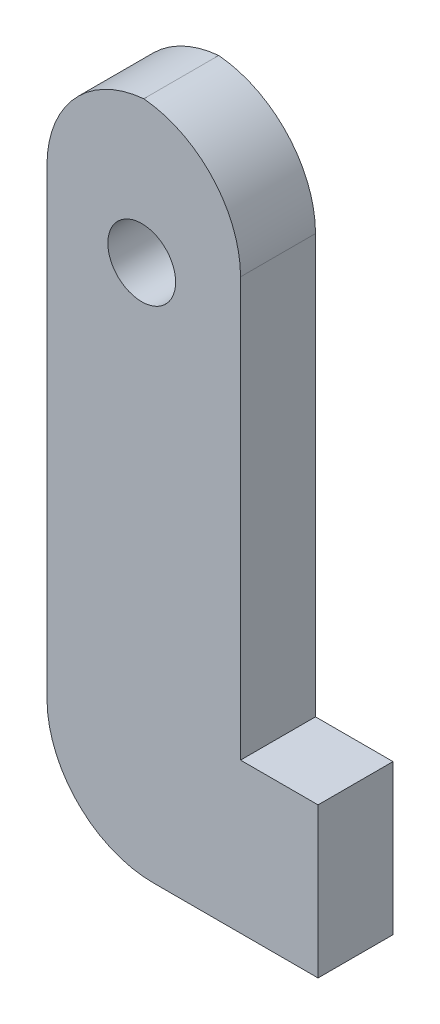
ISO-10303-21;
HEADER;
FILE_DESCRIPTION(('STEP AP214'),'2;1');
FILE_NAME('part.step','',(''),(''),'','','');
FILE_SCHEMA(('AUTOMOTIVE_DESIGN { 1 0 10303 214 1 1 1 1 }'));
ENDSEC;
DATA;
#1=APPLICATION_CONTEXT('core data for automotive mechanical design processes');
#2=APPLICATION_PROTOCOL_DEFINITION('international standard','automotive_design',2000,#1);
#3=PRODUCT_CONTEXT('',#1,'mechanical');
#4=PRODUCT('Part','Part','',(#3));
#5=PRODUCT_RELATED_PRODUCT_CATEGORY('part','',(#4));
#6=PRODUCT_DEFINITION_FORMATION('','',#4);
#7=PRODUCT_DEFINITION_CONTEXT('part definition',#1,'design');
#8=PRODUCT_DEFINITION('design','',#6,#7);
#9=PRODUCT_DEFINITION_SHAPE('','',#8);
#10=(LENGTH_UNIT() NAMED_UNIT(*) SI_UNIT(.MILLI.,.METRE.));
#11=(NAMED_UNIT(*) PLANE_ANGLE_UNIT() SI_UNIT($,.RADIAN.));
#12=(NAMED_UNIT(*) SI_UNIT($,.STERADIAN.) SOLID_ANGLE_UNIT());
#13=UNCERTAINTY_MEASURE_WITH_UNIT(LENGTH_MEASURE(1.E-05),#10,'distance_accuracy_value','');
#14=(GEOMETRIC_REPRESENTATION_CONTEXT(3) GLOBAL_UNCERTAINTY_ASSIGNED_CONTEXT((#13)) GLOBAL_UNIT_ASSIGNED_CONTEXT((#10,
#11,#12)) REPRESENTATION_CONTEXT('',''));
#15=CARTESIAN_POINT('',(0.,0.,0.));
#16=DIRECTION('',(0.,0.,1.));
#17=DIRECTION('',(1.,0.,0.));
#18=AXIS2_PLACEMENT_3D('',#15,#16,#17);
#19=CARTESIAN_POINT('',(0.,0.,6.35));
#20=DIRECTION('',(0.,0.,-1.));
#21=DIRECTION('',(-1.,0.,0.));
#22=AXIS2_PLACEMENT_3D('',#19,#20,#21);
#23=PLANE('',#22);
#24=DIRECTION('',(0.,-1.,0.));
#25=VECTOR('',#24,1.);
#26=CARTESIAN_POINT('',(-61.6,14.2826348225761,6.35));
#27=LINE('',#26,#25);
#28=CARTESIAN_POINT('',(-61.6,62.432634822576,6.35));
#29=VERTEX_POINT('',#28);
#30=CARTESIAN_POINT('',(-61.6,23.282634822576,6.35));
#31=VERTEX_POINT('',#30);
#32=EDGE_CURVE('E161',#29,#31,#27,.T.);
#33=ORIENTED_EDGE('',*,*,#32,.T.);
#34=CARTESIAN_POINT('',(-52.6,23.282634822576,6.35));
#35=DIRECTION('',(0.,0.,-1.));
#36=DIRECTION('',(-1.,0.,0.));
#37=AXIS2_PLACEMENT_3D('',#34,#35,#36);
#38=CIRCLE('',#37,9.);
#39=CARTESIAN_POINT('',(-52.6,14.2826348225761,6.35));
#40=VERTEX_POINT('',#39);
#41=EDGE_CURVE('E11',#31,#40,#38,.F.);
#42=ORIENTED_EDGE('',*,*,#41,.T.);
#43=DIRECTION('',(1.,0.,0.));
#44=VECTOR('',#43,1.);
#45=CARTESIAN_POINT('',(-45.2069500644702,14.2826348225761,6.35));
#46=LINE('',#45,#44);
#47=CARTESIAN_POINT('',(-38.6420901517407,14.2826348225761,6.35));
#48=VERTEX_POINT('',#47);
#49=EDGE_CURVE('E115',#40,#48,#46,.T.);
#50=ORIENTED_EDGE('',*,*,#49,.T.);
#51=DIRECTION('',(0.,1.,0.));
#52=VECTOR('',#51,1.);
#53=CARTESIAN_POINT('',(-38.6420901517407,26.9826348225761,6.35));
#54=LINE('',#53,#52);
#55=CARTESIAN_POINT('',(-38.6420901517407,26.9826348225761,6.35));
#56=VERTEX_POINT('',#55);
#57=EDGE_CURVE('E110',#48,#56,#54,.T.);
#58=ORIENTED_EDGE('',*,*,#57,.T.);
#59=DIRECTION('',(-1.,0.,0.));
#60=VECTOR('',#59,1.);
#61=CARTESIAN_POINT('',(-38.6420901517407,26.9826348225761,6.35));
#62=LINE('',#61,#60);
#63=CARTESIAN_POINT('',(-45.2069500644702,26.9826348225761,6.35));
#64=VERTEX_POINT('',#63);
#65=EDGE_CURVE('E98',#56,#64,#62,.T.);
#66=ORIENTED_EDGE('',*,*,#65,.T.);
#67=DIRECTION('',(0.,1.,0.));
#68=VECTOR('',#67,1.);
#69=CARTESIAN_POINT('',(-45.2069500644702,26.9826348225761,6.35));
#70=LINE('',#69,#68);
#71=CARTESIAN_POINT('',(-45.2069500644702,62.432634822576,6.35));
#72=VERTEX_POINT('',#71);
#73=EDGE_CURVE('E109',#64,#72,#70,.T.);
#74=ORIENTED_EDGE('',*,*,#73,.T.);
#75=CARTESIAN_POINT('',(-54.2069500644702,62.4326348225761,6.35));
#76=DIRECTION('',(0.,0.,-1.));
#77=DIRECTION('',(-1.,0.,0.));
#78=AXIS2_PLACEMENT_3D('',#75,#76,#77);
#79=CIRCLE('',#78,9.);
#80=CARTESIAN_POINT('',(-53.4034750322351,71.3966979567008,6.35));
#81=VERTEX_POINT('',#80);
#82=EDGE_CURVE('E138',#72,#81,#79,.F.);
#83=ORIENTED_EDGE('',*,*,#82,.T.);
#84=CARTESIAN_POINT('',(-52.6,62.4326348225761,6.35));
#85=DIRECTION('',(0.,0.,-1.));
#86=DIRECTION('',(-1.,0.,0.));
#87=AXIS2_PLACEMENT_3D('',#84,#85,#86);
#88=CIRCLE('',#87,9.);
#89=EDGE_CURVE('E136',#81,#29,#88,.F.);
#90=ORIENTED_EDGE('',*,*,#89,.T.);
#91=EDGE_LOOP('',(#33,#42,#50,#58,#66,#74,#83,#90));
#92=FACE_BOUND('',#91,.T.);
#93=CARTESIAN_POINT('',(-53.575,59.2899417882053,6.35));
#94=DIRECTION('',(0.,0.,1.));
#95=DIRECTION('',(1.,0.,0.));
#96=AXIS2_PLACEMENT_3D('',#93,#94,#95);
#97=CIRCLE('',#96,2.87019999999999);
#98=CARTESIAN_POINT('',(-50.7048,59.2899417882053,6.35));
#99=VERTEX_POINT('',#98);
#100=EDGE_CURVE('E168',#99,#99,#97,.T.);
#101=ORIENTED_EDGE('',*,*,#100,.F.);
#102=EDGE_LOOP('',(#101));
#103=FACE_BOUND('',#102,.T.);
#104=ADVANCED_FACE('F33',(#92,#103),#23,.F.);
#105=CARTESIAN_POINT('',(0.,0.,0.));
#106=DIRECTION('',(0.,0.,-1.));
#107=DIRECTION('',(-1.,0.,0.));
#108=AXIS2_PLACEMENT_3D('',#105,#106,#107);
#109=PLANE('',#108);
#110=DIRECTION('',(1.,0.,0.));
#111=VECTOR('',#110,1.);
#112=CARTESIAN_POINT('',(-38.6420901517407,14.2826348225761,0.));
#113=LINE('',#112,#111);
#114=CARTESIAN_POINT('',(-52.6,14.282634822576,0.));
#115=VERTEX_POINT('',#114);
#116=CARTESIAN_POINT('',(-38.6420901517407,14.2826348225761,0.));
#117=VERTEX_POINT('',#116);
#118=EDGE_CURVE('E119',#115,#117,#113,.T.);
#119=ORIENTED_EDGE('',*,*,#118,.F.);
#120=CARTESIAN_POINT('',(-52.6,23.282634822576,0.));
#121=DIRECTION('',(0.,0.,-1.));
#122=DIRECTION('',(-1.,0.,0.));
#123=AXIS2_PLACEMENT_3D('',#120,#121,#122);
#124=CIRCLE('',#123,9.);
#125=CARTESIAN_POINT('',(-61.6,23.282634822576,0.));
#126=VERTEX_POINT('',#125);
#127=EDGE_CURVE('E55',#115,#126,#124,.T.);
#128=ORIENTED_EDGE('',*,*,#127,.T.);
#129=DIRECTION('',(0.,-1.,0.));
#130=VECTOR('',#129,1.);
#131=CARTESIAN_POINT('',(-61.6,14.2826348225761,0.));
#132=LINE('',#131,#130);
#133=CARTESIAN_POINT('',(-61.6,62.432634822576,0.));
#134=VERTEX_POINT('',#133);
#135=EDGE_CURVE('E156',#134,#126,#132,.T.);
#136=ORIENTED_EDGE('',*,*,#135,.F.);
#137=CARTESIAN_POINT('',(-52.6,62.4326348225761,0.));
#138=DIRECTION('',(0.,0.,-1.));
#139=DIRECTION('',(-1.,0.,0.));
#140=AXIS2_PLACEMENT_3D('',#137,#138,#139);
#141=CIRCLE('',#140,9.);
#142=CARTESIAN_POINT('',(-53.4034750322351,71.3966979567008,0.));
#143=VERTEX_POINT('',#142);
#144=EDGE_CURVE('E124',#134,#143,#141,.T.);
#145=ORIENTED_EDGE('',*,*,#144,.T.);
#146=CARTESIAN_POINT('',(-54.2069500644702,62.4326348225761,0.));
#147=DIRECTION('',(0.,0.,-1.));
#148=DIRECTION('',(-1.,0.,0.));
#149=AXIS2_PLACEMENT_3D('',#146,#147,#148);
#150=CIRCLE('',#149,9.);
#151=CARTESIAN_POINT('',(-45.2069500644702,62.432634822576,0.));
#152=VERTEX_POINT('',#151);
#153=EDGE_CURVE('E126',#143,#152,#150,.T.);
#154=ORIENTED_EDGE('',*,*,#153,.T.);
#155=DIRECTION('',(0.,1.,0.));
#156=VECTOR('',#155,1.);
#157=CARTESIAN_POINT('',(-45.2069500644702,26.9826348225761,0.));
#158=LINE('',#157,#156);
#159=CARTESIAN_POINT('',(-45.2069500644702,26.9826348225761,0.));
#160=VERTEX_POINT('',#159);
#161=EDGE_CURVE('E158',#160,#152,#158,.T.);
#162=ORIENTED_EDGE('',*,*,#161,.F.);
#163=DIRECTION('',(-1.,0.,0.));
#164=VECTOR('',#163,1.);
#165=CARTESIAN_POINT('',(-38.6420901517407,26.9826348225761,0.));
#166=LINE('',#165,#164);
#167=CARTESIAN_POINT('',(-38.6420901517407,26.9826348225761,0.));
#168=VERTEX_POINT('',#167);
#169=EDGE_CURVE('E167',#168,#160,#166,.T.);
#170=ORIENTED_EDGE('',*,*,#169,.F.);
#171=DIRECTION('',(0.,1.,0.));
#172=VECTOR('',#171,1.);
#173=CARTESIAN_POINT('',(-38.6420901517407,26.9826348225761,0.));
#174=LINE('',#173,#172);
#175=EDGE_CURVE('E123',#117,#168,#174,.T.);
#176=ORIENTED_EDGE('',*,*,#175,.F.);
#177=EDGE_LOOP('',(#119,#128,#136,#145,#154,#162,#170,#176));
#178=FACE_BOUND('',#177,.T.);
#179=CARTESIAN_POINT('',(-53.575,59.2899417882053,0.));
#180=DIRECTION('',(0.,0.,1.));
#181=DIRECTION('',(1.,0.,0.));
#182=AXIS2_PLACEMENT_3D('',#179,#180,#181);
#183=CIRCLE('',#182,2.87019999999999);
#184=CARTESIAN_POINT('',(-50.7048,59.2899417882053,0.));
#185=VERTEX_POINT('',#184);
#186=EDGE_CURVE('E146',#185,#185,#183,.T.);
#187=ORIENTED_EDGE('',*,*,#186,.T.);
#188=EDGE_LOOP('',(#187));
#189=FACE_BOUND('',#188,.T.);
#190=ADVANCED_FACE('F154',(#178,#189),#109,.T.);
#191=CARTESIAN_POINT('',(-38.6420901517407,26.9826348225761,6.35));
#192=DIRECTION('',(-1.,0.,0.));
#193=DIRECTION('',(0.,0.,1.));
#194=AXIS2_PLACEMENT_3D('',#191,#192,#193);
#195=PLANE('',#194);
#196=ORIENTED_EDGE('',*,*,#175,.T.);
#197=DIRECTION('',(0.,0.,-1.));
#198=VECTOR('',#197,1.);
#199=CARTESIAN_POINT('',(-38.6420901517407,26.9826348225761,6.35));
#200=LINE('',#199,#198);
#201=EDGE_CURVE('E102',#56,#168,#200,.T.);
#202=ORIENTED_EDGE('',*,*,#201,.F.);
#203=ORIENTED_EDGE('',*,*,#57,.F.);
#204=DIRECTION('',(0.,0.,-1.));
#205=VECTOR('',#204,1.);
#206=CARTESIAN_POINT('',(-38.6420901517407,14.2826348225761,6.35));
#207=LINE('',#206,#205);
#208=EDGE_CURVE('E128',#48,#117,#207,.T.);
#209=ORIENTED_EDGE('',*,*,#208,.T.);
#210=EDGE_LOOP('',(#196,#202,#203,#209));
#211=FACE_BOUND('',#210,.T.);
#212=ADVANCED_FACE('F121',(#211),#195,.F.);
#213=CARTESIAN_POINT('',(-38.6420901517407,26.9826348225761,6.35));
#214=DIRECTION('',(0.,-1.,0.));
#215=DIRECTION('',(0.,0.,-1.));
#216=AXIS2_PLACEMENT_3D('',#213,#214,#215);
#217=PLANE('',#216);
#218=ORIENTED_EDGE('',*,*,#169,.T.);
#219=DIRECTION('',(0.,0.,-1.));
#220=VECTOR('',#219,1.);
#221=CARTESIAN_POINT('',(-45.2069500644702,26.9826348225761,6.35));
#222=LINE('',#221,#220);
#223=EDGE_CURVE('E105',#64,#160,#222,.T.);
#224=ORIENTED_EDGE('',*,*,#223,.F.);
#225=ORIENTED_EDGE('',*,*,#65,.F.);
#226=ORIENTED_EDGE('',*,*,#201,.T.);
#227=EDGE_LOOP('',(#218,#224,#225,#226));
#228=FACE_BOUND('',#227,.T.);
#229=ADVANCED_FACE('F100',(#228),#217,.F.);
#230=CARTESIAN_POINT('',(-45.2069500644702,26.9826348225761,6.35));
#231=DIRECTION('',(-1.,0.,0.));
#232=DIRECTION('',(0.,0.,1.));
#233=AXIS2_PLACEMENT_3D('',#230,#231,#232);
#234=PLANE('',#233);
#235=ORIENTED_EDGE('',*,*,#161,.T.);
#236=DIRECTION('',(0.,0.,-1.));
#237=VECTOR('',#236,1.);
#238=CARTESIAN_POINT('',(-45.2069500644702,62.4326348225761,6.35));
#239=LINE('',#238,#237);
#240=EDGE_CURVE('E133',#152,#72,#239,.F.);
#241=ORIENTED_EDGE('',*,*,#240,.T.);
#242=ORIENTED_EDGE('',*,*,#73,.F.);
#243=ORIENTED_EDGE('',*,*,#223,.T.);
#244=EDGE_LOOP('',(#235,#241,#242,#243));
#245=FACE_BOUND('',#244,.T.);
#246=ADVANCED_FACE('F173',(#245),#234,.F.);
#247=CARTESIAN_POINT('',(-61.6,14.2826348225761,6.35));
#248=DIRECTION('',(1.,0.,0.));
#249=DIRECTION('',(0.,0.,-1.));
#250=AXIS2_PLACEMENT_3D('',#247,#248,#249);
#251=PLANE('',#250);
#252=ORIENTED_EDGE('',*,*,#135,.T.);
#253=DIRECTION('',(0.,0.,-1.));
#254=VECTOR('',#253,1.);
#255=CARTESIAN_POINT('',(-61.6,23.282634822576,6.35));
#256=LINE('',#255,#254);
#257=EDGE_CURVE('E41',#126,#31,#256,.F.);
#258=ORIENTED_EDGE('',*,*,#257,.T.);
#259=ORIENTED_EDGE('',*,*,#32,.F.);
#260=DIRECTION('',(0.,0.,-1.));
#261=VECTOR('',#260,1.);
#262=CARTESIAN_POINT('',(-61.6,62.4326348225761,6.35));
#263=LINE('',#262,#261);
#264=EDGE_CURVE('E140',#29,#134,#263,.T.);
#265=ORIENTED_EDGE('',*,*,#264,.T.);
#266=EDGE_LOOP('',(#252,#258,#259,#265));
#267=FACE_BOUND('',#266,.T.);
#268=ADVANCED_FACE('F183',(#267),#251,.F.);
#269=CARTESIAN_POINT('',(-38.6420901517407,14.2826348225761,6.35));
#270=DIRECTION('',(0.,1.,0.));
#271=DIRECTION('',(-1.,0.,0.));
#272=AXIS2_PLACEMENT_3D('',#269,#270,#271);
#273=PLANE('',#272);
#274=ORIENTED_EDGE('',*,*,#49,.F.);
#275=DIRECTION('',(0.,0.,-1.));
#276=VECTOR('',#275,1.);
#277=CARTESIAN_POINT('',(-52.6,14.282634822576,6.35));
#278=LINE('',#277,#276);
#279=EDGE_CURVE('E142',#40,#115,#278,.T.);
#280=ORIENTED_EDGE('',*,*,#279,.T.);
#281=ORIENTED_EDGE('',*,*,#118,.T.);
#282=ORIENTED_EDGE('',*,*,#208,.F.);
#283=EDGE_LOOP('',(#274,#280,#281,#282));
#284=FACE_BOUND('',#283,.T.);
#285=ADVANCED_FACE('F151',(#284),#273,.F.);
#286=CARTESIAN_POINT('',(-53.575,59.2899417882053,6.35));
#287=DIRECTION('',(0.,0.,-1.));
#288=DIRECTION('',(-1.,0.,0.));
#289=AXIS2_PLACEMENT_3D('',#286,#287,#288);
#290=CYLINDRICAL_SURFACE('',#289,2.87019999999999);
#291=ORIENTED_EDGE('',*,*,#100,.T.);
#292=EDGE_LOOP('',(#291));
#293=FACE_BOUND('',#292,.T.);
#294=ORIENTED_EDGE('',*,*,#186,.F.);
#295=EDGE_LOOP('',(#294));
#296=FACE_BOUND('',#295,.T.);
#297=ADVANCED_FACE('F196',(#293,#296),#290,.F.);
#298=CARTESIAN_POINT('',(-52.6,62.4326348225761,6.35));
#299=DIRECTION('',(0.,0.,-1.));
#300=DIRECTION('',(-1.,0.,0.));
#301=AXIS2_PLACEMENT_3D('',#298,#299,#300);
#302=CYLINDRICAL_SURFACE('',#301,9.);
#303=ORIENTED_EDGE('',*,*,#264,.F.);
#304=ORIENTED_EDGE('',*,*,#89,.F.);
#305=DIRECTION('',(0.,0.,-1.));
#306=VECTOR('',#305,1.);
#307=CARTESIAN_POINT('',(-53.4034750322351,71.3966979567008,3.175));
#308=LINE('',#307,#306);
#309=EDGE_CURVE('E143',#143,#81,#308,.F.);
#310=ORIENTED_EDGE('',*,*,#309,.F.);
#311=ORIENTED_EDGE('',*,*,#144,.F.);
#312=EDGE_LOOP('',(#303,#304,#310,#311));
#313=FACE_BOUND('',#312,.T.);
#314=ADVANCED_FACE('F181',(#313),#302,.T.);
#315=CARTESIAN_POINT('',(-54.2069500644702,62.4326348225761,6.35));
#316=DIRECTION('',(0.,0.,-1.));
#317=DIRECTION('',(-1.,0.,0.));
#318=AXIS2_PLACEMENT_3D('',#315,#316,#317);
#319=CYLINDRICAL_SURFACE('',#318,9.);
#320=ORIENTED_EDGE('',*,*,#82,.F.);
#321=ORIENTED_EDGE('',*,*,#240,.F.);
#322=ORIENTED_EDGE('',*,*,#153,.F.);
#323=ORIENTED_EDGE('',*,*,#309,.T.);
#324=EDGE_LOOP('',(#320,#321,#322,#323));
#325=FACE_BOUND('',#324,.T.);
#326=ADVANCED_FACE('F176',(#325),#319,.T.);
#327=CARTESIAN_POINT('',(-52.6,23.282634822576,6.35));
#328=DIRECTION('',(0.,0.,-1.));
#329=DIRECTION('',(-1.,0.,0.));
#330=AXIS2_PLACEMENT_3D('',#327,#328,#329);
#331=CYLINDRICAL_SURFACE('',#330,9.);
#332=ORIENTED_EDGE('',*,*,#41,.F.);
#333=ORIENTED_EDGE('',*,*,#257,.F.);
#334=ORIENTED_EDGE('',*,*,#127,.F.);
#335=ORIENTED_EDGE('',*,*,#279,.F.);
#336=EDGE_LOOP('',(#332,#333,#334,#335));
#337=FACE_BOUND('',#336,.T.);
#338=ADVANCED_FACE('F35',(#337),#331,.T.);
#339=CLOSED_SHELL('',(#104,#190,#212,#229,#246,#268,#285,#297,#314,#326,#338));
#340=MANIFOLD_SOLID_BREP('B2',#339);
#341=ADVANCED_BREP_SHAPE_REPRESENTATION('',(#18,#340),#14);
#342=SHAPE_DEFINITION_REPRESENTATION(#9,#341);
ENDSEC;
END-ISO-10303-21;
